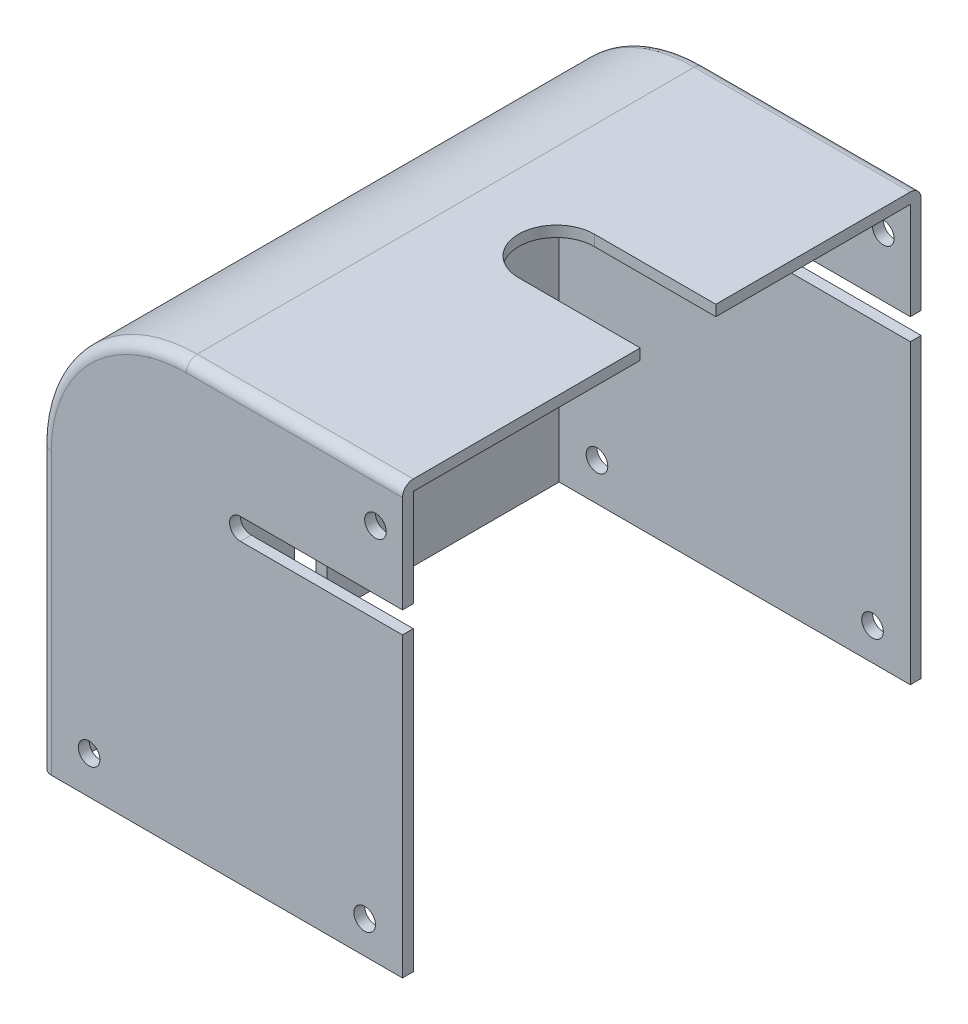
ISO-10303-21;
HEADER;
FILE_DESCRIPTION(('STEP AP214'),'2;1');
FILE_NAME('part.step','',(''),(''),'','','');
FILE_SCHEMA(('AUTOMOTIVE_DESIGN { 1 0 10303 214 1 1 1 1 }'));
ENDSEC;
DATA;
#1=APPLICATION_CONTEXT('core data for automotive mechanical design processes');
#2=APPLICATION_PROTOCOL_DEFINITION('international standard','automotive_design',2000,#1);
#3=PRODUCT_CONTEXT('',#1,'mechanical');
#4=PRODUCT('Part','Part','',(#3));
#5=PRODUCT_RELATED_PRODUCT_CATEGORY('part','',(#4));
#6=PRODUCT_DEFINITION_FORMATION('','',#4);
#7=PRODUCT_DEFINITION_CONTEXT('part definition',#1,'design');
#8=PRODUCT_DEFINITION('design','',#6,#7);
#9=PRODUCT_DEFINITION_SHAPE('','',#8);
#10=(LENGTH_UNIT() NAMED_UNIT(*) SI_UNIT(.MILLI.,.METRE.));
#11=(NAMED_UNIT(*) PLANE_ANGLE_UNIT() SI_UNIT($,.RADIAN.));
#12=(NAMED_UNIT(*) SI_UNIT($,.STERADIAN.) SOLID_ANGLE_UNIT());
#13=UNCERTAINTY_MEASURE_WITH_UNIT(LENGTH_MEASURE(1.E-05),#10,'distance_accuracy_value','');
#14=(GEOMETRIC_REPRESENTATION_CONTEXT(3) GLOBAL_UNCERTAINTY_ASSIGNED_CONTEXT((#13)) GLOBAL_UNIT_ASSIGNED_CONTEXT((#10,
#11,#12)) REPRESENTATION_CONTEXT('',''));
#15=CARTESIAN_POINT('',(0.,0.,0.));
#16=DIRECTION('',(0.,0.,1.));
#17=DIRECTION('',(1.,0.,0.));
#18=AXIS2_PLACEMENT_3D('',#15,#16,#17);
#19=CARTESIAN_POINT('',(0.,0.,46.));
#20=DIRECTION('',(-1.,0.,0.));
#21=DIRECTION('',(0.,0.,1.));
#22=AXIS2_PLACEMENT_3D('',#19,#20,#21);
#23=PLANE('',#22);
#24=DIRECTION('',(0.,0.,-1.));
#25=VECTOR('',#24,1.);
#26=CARTESIAN_POINT('',(0.,0.,46.));
#27=LINE('',#26,#25);
#28=CARTESIAN_POINT('',(0.,0.,46.));
#29=VERTEX_POINT('',#28);
#30=CARTESIAN_POINT('',(0.,0.,4.));
#31=VERTEX_POINT('',#30);
#32=EDGE_CURVE('E473',#29,#31,#27,.T.);
#33=ORIENTED_EDGE('',*,*,#32,.T.);
#34=DIRECTION('',(0.,1.,0.));
#35=VECTOR('',#34,1.);
#36=CARTESIAN_POINT('',(0.,-77.,4.));
#37=LINE('',#36,#35);
#38=CARTESIAN_POINT('',(0.,2.,4.));
#39=VERTEX_POINT('',#38);
#40=EDGE_CURVE('E364',#31,#39,#37,.T.);
#41=ORIENTED_EDGE('',*,*,#40,.T.);
#42=DIRECTION('',(0.,0.,-1.));
#43=VECTOR('',#42,1.);
#44=CARTESIAN_POINT('',(0.,2.,46.));
#45=LINE('',#44,#43);
#46=CARTESIAN_POINT('',(0.,2.,46.));
#47=VERTEX_POINT('',#46);
#48=EDGE_CURVE('E263',#47,#39,#45,.T.);
#49=ORIENTED_EDGE('',*,*,#48,.F.);
#50=CARTESIAN_POINT('',(0.,0.,46.));
#51=DIRECTION('',(-1.,0.,0.));
#52=DIRECTION('',(0.,0.,1.));
#53=AXIS2_PLACEMENT_3D('',#50,#51,#52);
#54=CIRCLE('',#53,2.);
#55=CARTESIAN_POINT('',(0.,0.,48.));
#56=VERTEX_POINT('',#55);
#57=EDGE_CURVE('E295',#47,#56,#54,.F.);
#58=ORIENTED_EDGE('',*,*,#57,.T.);
#59=DIRECTION('',(0.,1.,0.));
#60=VECTOR('',#59,1.);
#61=CARTESIAN_POINT('',(0.,-77.,48.));
#62=LINE('',#61,#60);
#63=CARTESIAN_POINT('',(0.,-18.,48.));
#64=VERTEX_POINT('',#63);
#65=EDGE_CURVE('E442',#64,#56,#62,.T.);
#66=ORIENTED_EDGE('',*,*,#65,.F.);
#67=DIRECTION('',(0.,0.,1.));
#68=VECTOR('',#67,1.);
#69=CARTESIAN_POINT('',(0.,-18.,-48.));
#70=LINE('',#69,#68);
#71=CARTESIAN_POINT('',(0.,-18.,46.));
#72=VERTEX_POINT('',#71);
#73=EDGE_CURVE('E64',#72,#64,#70,.T.);
#74=ORIENTED_EDGE('',*,*,#73,.F.);
#75=DIRECTION('',(0.,1.,0.));
#76=VECTOR('',#75,1.);
#77=CARTESIAN_POINT('',(0.,-77.,46.));
#78=LINE('',#77,#76);
#79=EDGE_CURVE('E449',#72,#29,#78,.T.);
#80=ORIENTED_EDGE('',*,*,#79,.T.);
#81=EDGE_LOOP('',(#33,#41,#49,#58,#66,#74,#80));
#82=FACE_BOUND('',#81,.T.);
#83=ADVANCED_FACE('F39',(#82),#23,.F.);
#84=CARTESIAN_POINT('',(0.,-77.,46.));
#85=VERTEX_POINT('',#84);
#86=CARTESIAN_POINT('',(0.,-22.,46.));
#87=VERTEX_POINT('',#86);
#88=EDGE_CURVE('E443',#85,#87,#78,.T.);
#89=ORIENTED_EDGE('',*,*,#88,.T.);
#90=DIRECTION('',(0.,0.,1.));
#91=VECTOR('',#90,1.);
#92=CARTESIAN_POINT('',(0.,-22.,-48.));
#93=LINE('',#92,#91);
#94=CARTESIAN_POINT('',(0.,-22.,48.));
#95=VERTEX_POINT('',#94);
#96=EDGE_CURVE('E390',#87,#95,#93,.T.);
#97=ORIENTED_EDGE('',*,*,#96,.T.);
#98=CARTESIAN_POINT('',(0.,-77.,48.));
#99=VERTEX_POINT('',#98);
#100=EDGE_CURVE('E444',#99,#95,#62,.T.);
#101=ORIENTED_EDGE('',*,*,#100,.F.);
#102=DIRECTION('',(0.,0.,-1.));
#103=VECTOR('',#102,1.);
#104=CARTESIAN_POINT('',(0.,-77.,48.));
#105=LINE('',#104,#103);
#106=EDGE_CURVE('E447',#99,#85,#105,.T.);
#107=ORIENTED_EDGE('',*,*,#106,.T.);
#108=EDGE_LOOP('',(#89,#97,#101,#107));
#109=FACE_BOUND('',#108,.T.);
#110=ADVANCED_FACE('F564',(#109),#23,.F.);
#111=DIRECTION('',(0.,1.,0.));
#112=VECTOR('',#111,1.);
#113=CARTESIAN_POINT('',(0.,-77.,-48.));
#114=LINE('',#113,#112);
#115=CARTESIAN_POINT('',(0.,-77.,-48.));
#116=VERTEX_POINT('',#115);
#117=CARTESIAN_POINT('',(0.,-22.,-48.));
#118=VERTEX_POINT('',#117);
#119=EDGE_CURVE('E425',#116,#118,#114,.T.);
#120=ORIENTED_EDGE('',*,*,#119,.T.);
#121=CARTESIAN_POINT('',(0.,-22.,-46.));
#122=VERTEX_POINT('',#121);
#123=EDGE_CURVE('E386',#118,#122,#93,.T.);
#124=ORIENTED_EDGE('',*,*,#123,.T.);
#125=DIRECTION('',(0.,1.,0.));
#126=VECTOR('',#125,1.);
#127=CARTESIAN_POINT('',(0.,-77.,-46.));
#128=LINE('',#127,#126);
#129=CARTESIAN_POINT('',(0.,-77.,-46.));
#130=VERTEX_POINT('',#129);
#131=EDGE_CURVE('E432',#130,#122,#128,.T.);
#132=ORIENTED_EDGE('',*,*,#131,.F.);
#133=DIRECTION('',(0.,0.,1.));
#134=VECTOR('',#133,1.);
#135=CARTESIAN_POINT('',(0.,-77.,-48.));
#136=LINE('',#135,#134);
#137=EDGE_CURVE('E431',#116,#130,#136,.T.);
#138=ORIENTED_EDGE('',*,*,#137,.F.);
#139=EDGE_LOOP('',(#120,#124,#132,#138));
#140=FACE_BOUND('',#139,.T.);
#141=ADVANCED_FACE('F518',(#140),#23,.F.);
#142=CARTESIAN_POINT('',(-65.,-77.,46.));
#143=DIRECTION('',(0.,1.,0.));
#144=DIRECTION('',(0.,0.,1.));
#145=AXIS2_PLACEMENT_3D('',#142,#143,#144);
#146=PLANE('',#145);
#147=DIRECTION('',(0.,0.,-1.));
#148=VECTOR('',#147,1.);
#149=CARTESIAN_POINT('',(-65.,-77.,46.));
#150=LINE('',#149,#148);
#151=CARTESIAN_POINT('',(-65.,-77.,-3.));
#152=VERTEX_POINT('',#151);
#153=CARTESIAN_POINT('',(-65.,-77.,-46.));
#154=VERTEX_POINT('',#153);
#155=EDGE_CURVE('E482',#152,#154,#150,.T.);
#156=ORIENTED_EDGE('',*,*,#155,.F.);
#157=DIRECTION('',(-1.,0.,0.));
#158=VECTOR('',#157,1.);
#159=CARTESIAN_POINT('',(-62.,-77.,-3.));
#160=LINE('',#159,#158);
#161=CARTESIAN_POINT('',(-67.,-77.,-3.));
#162=VERTEX_POINT('',#161);
#163=EDGE_CURVE('E318',#152,#162,#160,.T.);
#164=ORIENTED_EDGE('',*,*,#163,.T.);
#165=DIRECTION('',(0.,0.,-1.));
#166=VECTOR('',#165,1.);
#167=CARTESIAN_POINT('',(-67.,-77.,46.));
#168=LINE('',#167,#166);
#169=CARTESIAN_POINT('',(-67.,-77.,-46.));
#170=VERTEX_POINT('',#169);
#171=EDGE_CURVE('E486',#162,#170,#168,.T.);
#172=ORIENTED_EDGE('',*,*,#171,.T.);
#173=CARTESIAN_POINT('',(-65.,-77.,-46.));
#174=DIRECTION('',(0.,1.,0.));
#175=DIRECTION('',(0.,0.,1.));
#176=AXIS2_PLACEMENT_3D('',#173,#174,#175);
#177=CIRCLE('',#176,2.);
#178=CARTESIAN_POINT('',(-65.,-77.,-48.));
#179=VERTEX_POINT('',#178);
#180=EDGE_CURVE('E278',#170,#179,#177,.F.);
#181=ORIENTED_EDGE('',*,*,#180,.T.);
#182=DIRECTION('',(1.,0.,0.));
#183=VECTOR('',#182,1.);
#184=CARTESIAN_POINT('',(-67.,-77.,-48.));
#185=LINE('',#184,#183);
#186=EDGE_CURVE('E428',#179,#116,#185,.T.);
#187=ORIENTED_EDGE('',*,*,#186,.T.);
#188=ORIENTED_EDGE('',*,*,#137,.T.);
#189=DIRECTION('',(1.,0.,0.));
#190=VECTOR('',#189,1.);
#191=CARTESIAN_POINT('',(-67.,-77.,-46.));
#192=LINE('',#191,#190);
#193=EDGE_CURVE('E435',#154,#130,#192,.T.);
#194=ORIENTED_EDGE('',*,*,#193,.F.);
#195=EDGE_LOOP('',(#156,#164,#172,#181,#187,#188,#194));
#196=FACE_BOUND('',#195,.T.);
#197=ADVANCED_FACE('F511',(#196),#146,.F.);
#198=CARTESIAN_POINT('',(0.,2.,-10.));
#199=VERTEX_POINT('',#198);
#200=CARTESIAN_POINT('',(0.,2.,-46.));
#201=VERTEX_POINT('',#200);
#202=EDGE_CURVE('E252',#199,#201,#45,.T.);
#203=ORIENTED_EDGE('',*,*,#202,.F.);
#204=DIRECTION('',(0.,1.,0.));
#205=VECTOR('',#204,1.);
#206=CARTESIAN_POINT('',(0.,-77.,-10.));
#207=LINE('',#206,#205);
#208=CARTESIAN_POINT('',(0.,0.,-10.));
#209=VERTEX_POINT('',#208);
#210=EDGE_CURVE('E237',#209,#199,#207,.T.);
#211=ORIENTED_EDGE('',*,*,#210,.F.);
#212=CARTESIAN_POINT('',(0.,0.,-46.));
#213=VERTEX_POINT('',#212);
#214=EDGE_CURVE('E465',#209,#213,#27,.T.);
#215=ORIENTED_EDGE('',*,*,#214,.T.);
#216=CARTESIAN_POINT('',(0.,-18.,-46.));
#217=VERTEX_POINT('',#216);
#218=EDGE_CURVE('E314',#217,#213,#128,.T.);
#219=ORIENTED_EDGE('',*,*,#218,.F.);
#220=CARTESIAN_POINT('',(0.,-18.,-48.));
#221=VERTEX_POINT('',#220);
#222=EDGE_CURVE('E399',#221,#217,#70,.T.);
#223=ORIENTED_EDGE('',*,*,#222,.F.);
#224=CARTESIAN_POINT('',(0.,0.,-48.));
#225=VERTEX_POINT('',#224);
#226=EDGE_CURVE('E429',#221,#225,#114,.T.);
#227=ORIENTED_EDGE('',*,*,#226,.T.);
#228=CARTESIAN_POINT('',(0.,0.,-46.));
#229=DIRECTION('',(-1.,0.,0.));
#230=DIRECTION('',(0.,0.,1.));
#231=AXIS2_PLACEMENT_3D('',#228,#229,#230);
#232=CIRCLE('',#231,2.);
#233=EDGE_CURVE('E261',#225,#201,#232,.F.);
#234=ORIENTED_EDGE('',*,*,#233,.T.);
#235=EDGE_LOOP('',(#203,#211,#215,#219,#223,#227,#234));
#236=FACE_BOUND('',#235,.T.);
#237=ADVANCED_FACE('F259',(#236),#23,.F.);
#238=CARTESIAN_POINT('',(0.,2.,46.));
#239=DIRECTION('',(0.,-1.,0.));
#240=DIRECTION('',(0.,0.,-1.));
#241=AXIS2_PLACEMENT_3D('',#238,#239,#240);
#242=PLANE('',#241);
#243=ORIENTED_EDGE('',*,*,#48,.T.);
#244=DIRECTION('',(1.,0.,0.));
#245=VECTOR('',#244,1.);
#246=CARTESIAN_POINT('',(0.,2.,4.));
#247=LINE('',#246,#245);
#248=CARTESIAN_POINT('',(-22.5,2.,4.));
#249=VERTEX_POINT('',#248);
#250=EDGE_CURVE('E247',#249,#39,#247,.T.);
#251=ORIENTED_EDGE('',*,*,#250,.F.);
#252=CARTESIAN_POINT('',(-22.5,2.,-3.));
#253=DIRECTION('',(0.,1.,0.));
#254=DIRECTION('',(0.,0.,1.));
#255=AXIS2_PLACEMENT_3D('',#252,#253,#254);
#256=CIRCLE('',#255,7.);
#257=CARTESIAN_POINT('',(-22.5,2.,-10.));
#258=VERTEX_POINT('',#257);
#259=EDGE_CURVE('E256',#258,#249,#256,.T.);
#260=ORIENTED_EDGE('',*,*,#259,.F.);
#261=DIRECTION('',(-1.,0.,0.));
#262=VECTOR('',#261,1.);
#263=CARTESIAN_POINT('',(0.,2.,-10.));
#264=LINE('',#263,#262);
#265=EDGE_CURVE('E240',#199,#258,#264,.T.);
#266=ORIENTED_EDGE('',*,*,#265,.F.);
#267=ORIENTED_EDGE('',*,*,#202,.T.);
#268=DIRECTION('',(-1.,0.,0.));
#269=VECTOR('',#268,1.);
#270=CARTESIAN_POINT('',(-40.,2.,-46.));
#271=LINE('',#270,#269);
#272=CARTESIAN_POINT('',(-40.,2.,-46.));
#273=VERTEX_POINT('',#272);
#274=EDGE_CURVE('E293',#201,#273,#271,.T.);
#275=ORIENTED_EDGE('',*,*,#274,.T.);
#276=DIRECTION('',(0.,0.,-1.));
#277=VECTOR('',#276,1.);
#278=CARTESIAN_POINT('',(-40.,2.,46.));
#279=LINE('',#278,#277);
#280=CARTESIAN_POINT('',(-40.,2.,46.));
#281=VERTEX_POINT('',#280);
#282=EDGE_CURVE('E264',#281,#273,#279,.T.);
#283=ORIENTED_EDGE('',*,*,#282,.F.);
#284=DIRECTION('',(-1.,0.,0.));
#285=VECTOR('',#284,1.);
#286=CARTESIAN_POINT('',(0.,2.,46.));
#287=LINE('',#286,#285);
#288=EDGE_CURVE('E291',#281,#47,#287,.F.);
#289=ORIENTED_EDGE('',*,*,#288,.T.);
#290=EDGE_LOOP('',(#243,#251,#260,#266,#267,#275,#283,#289));
#291=FACE_BOUND('',#290,.T.);
#292=ADVANCED_FACE('F251',(#291),#242,.F.);
#293=CARTESIAN_POINT('',(-40.,-25.,46.));
#294=DIRECTION('',(0.,0.,-1.));
#295=DIRECTION('',(-1.,0.,0.));
#296=AXIS2_PLACEMENT_3D('',#293,#294,#295);
#297=CYLINDRICAL_SURFACE('',#296,27.);
#298=ORIENTED_EDGE('',*,*,#282,.T.);
#299=CARTESIAN_POINT('',(-40.,-25.,-46.));
#300=DIRECTION('',(0.,0.,-1.));
#301=DIRECTION('',(-1.,0.,0.));
#302=AXIS2_PLACEMENT_3D('',#299,#300,#301);
#303=CIRCLE('',#302,27.);
#304=CARTESIAN_POINT('',(-67.,-25.,-46.));
#305=VERTEX_POINT('',#304);
#306=EDGE_CURVE('E289',#273,#305,#303,.F.);
#307=ORIENTED_EDGE('',*,*,#306,.T.);
#308=DIRECTION('',(0.,0.,-1.));
#309=VECTOR('',#308,1.);
#310=CARTESIAN_POINT('',(-67.,-25.,46.));
#311=LINE('',#310,#309);
#312=CARTESIAN_POINT('',(-67.,-25.,46.));
#313=VERTEX_POINT('',#312);
#314=EDGE_CURVE('E268',#313,#305,#311,.T.);
#315=ORIENTED_EDGE('',*,*,#314,.F.);
#316=CARTESIAN_POINT('',(-40.,-25.,46.));
#317=DIRECTION('',(0.,0.,1.));
#318=DIRECTION('',(1.,0.,0.));
#319=AXIS2_PLACEMENT_3D('',#316,#317,#318);
#320=CIRCLE('',#319,27.);
#321=EDGE_CURVE('E287',#313,#281,#320,.F.);
#322=ORIENTED_EDGE('',*,*,#321,.T.);
#323=EDGE_LOOP('',(#298,#307,#315,#322));
#324=FACE_BOUND('',#323,.T.);
#325=ADVANCED_FACE('F578',(#324),#297,.T.);
#326=CARTESIAN_POINT('',(-67.,-25.,46.));
#327=DIRECTION('',(1.,0.,0.));
#328=DIRECTION('',(0.,0.,-1.));
#329=AXIS2_PLACEMENT_3D('',#326,#327,#328);
#330=PLANE('',#329);
#331=ORIENTED_EDGE('',*,*,#171,.F.);
#332=DIRECTION('',(0.,-1.,0.));
#333=VECTOR('',#332,1.);
#334=CARTESIAN_POINT('',(-67.,-77.,-3.));
#335=LINE('',#334,#333);
#336=CARTESIAN_POINT('',(-67.,-47.,-3.));
#337=VERTEX_POINT('',#336);
#338=EDGE_CURVE('E415',#337,#162,#335,.T.);
#339=ORIENTED_EDGE('',*,*,#338,.F.);
#340=CARTESIAN_POINT('',(-67.,-47.,0.));
#341=DIRECTION('',(-1.,0.,0.));
#342=DIRECTION('',(0.,0.,1.));
#343=AXIS2_PLACEMENT_3D('',#340,#341,#342);
#344=CIRCLE('',#343,3.);
#345=CARTESIAN_POINT('',(-67.,-47.,3.));
#346=VERTEX_POINT('',#345);
#347=EDGE_CURVE('E412',#346,#337,#344,.T.);
#348=ORIENTED_EDGE('',*,*,#347,.F.);
#349=DIRECTION('',(0.,1.,0.));
#350=VECTOR('',#349,1.);
#351=CARTESIAN_POINT('',(-67.,-77.,3.));
#352=LINE('',#351,#350);
#353=CARTESIAN_POINT('',(-67.,-77.,3.));
#354=VERTEX_POINT('',#353);
#355=EDGE_CURVE('E409',#354,#346,#352,.T.);
#356=ORIENTED_EDGE('',*,*,#355,.F.);
#357=CARTESIAN_POINT('',(-67.,-77.,46.));
#358=VERTEX_POINT('',#357);
#359=EDGE_CURVE('E487',#358,#354,#168,.T.);
#360=ORIENTED_EDGE('',*,*,#359,.F.);
#361=DIRECTION('',(0.,-1.,0.));
#362=VECTOR('',#361,1.);
#363=CARTESIAN_POINT('',(-67.,-25.,46.));
#364=LINE('',#363,#362);
#365=EDGE_CURVE('E266',#358,#313,#364,.F.);
#366=ORIENTED_EDGE('',*,*,#365,.T.);
#367=ORIENTED_EDGE('',*,*,#314,.T.);
#368=DIRECTION('',(0.,-1.,0.));
#369=VECTOR('',#368,1.);
#370=CARTESIAN_POINT('',(-67.,-77.,-46.));
#371=LINE('',#370,#369);
#372=EDGE_CURVE('E273',#305,#170,#371,.T.);
#373=ORIENTED_EDGE('',*,*,#372,.T.);
#374=EDGE_LOOP('',(#331,#339,#348,#356,#360,#366,#367,#373));
#375=FACE_BOUND('',#374,.T.);
#376=ADVANCED_FACE('F494',(#375),#330,.F.);
#377=ORIENTED_EDGE('',*,*,#359,.T.);
#378=DIRECTION('',(-1.,0.,0.));
#379=VECTOR('',#378,1.);
#380=CARTESIAN_POINT('',(-62.,-77.,3.));
#381=LINE('',#380,#379);
#382=CARTESIAN_POINT('',(-65.,-77.,3.));
#383=VERTEX_POINT('',#382);
#384=EDGE_CURVE('E417',#383,#354,#381,.T.);
#385=ORIENTED_EDGE('',*,*,#384,.F.);
#386=CARTESIAN_POINT('',(-65.,-77.,46.));
#387=VERTEX_POINT('',#386);
#388=EDGE_CURVE('E483',#387,#383,#150,.T.);
#389=ORIENTED_EDGE('',*,*,#388,.F.);
#390=DIRECTION('',(1.,0.,0.));
#391=VECTOR('',#390,1.);
#392=CARTESIAN_POINT('',(-67.,-77.,46.));
#393=LINE('',#392,#391);
#394=EDGE_CURVE('E439',#387,#85,#393,.T.);
#395=ORIENTED_EDGE('',*,*,#394,.T.);
#396=ORIENTED_EDGE('',*,*,#106,.F.);
#397=DIRECTION('',(1.,0.,0.));
#398=VECTOR('',#397,1.);
#399=CARTESIAN_POINT('',(-67.,-77.,48.));
#400=LINE('',#399,#398);
#401=CARTESIAN_POINT('',(-65.,-77.,48.));
#402=VERTEX_POINT('',#401);
#403=EDGE_CURVE('E440',#402,#99,#400,.T.);
#404=ORIENTED_EDGE('',*,*,#403,.F.);
#405=CARTESIAN_POINT('',(-65.,-77.,46.));
#406=DIRECTION('',(0.,1.,0.));
#407=DIRECTION('',(0.,0.,1.));
#408=AXIS2_PLACEMENT_3D('',#405,#406,#407);
#409=CIRCLE('',#408,2.);
#410=EDGE_CURVE('E276',#402,#358,#409,.F.);
#411=ORIENTED_EDGE('',*,*,#410,.T.);
#412=EDGE_LOOP('',(#377,#385,#389,#395,#396,#404,#411));
#413=FACE_BOUND('',#412,.T.);
#414=ADVANCED_FACE('F537',(#413),#146,.F.);
#415=CARTESIAN_POINT('',(-65.,-25.,46.));
#416=DIRECTION('',(-1.,0.,0.));
#417=DIRECTION('',(0.,-1.,0.));
#418=AXIS2_PLACEMENT_3D('',#415,#416,#417);
#419=PLANE('',#418);
#420=CARTESIAN_POINT('',(-65.,-47.,0.));
#421=DIRECTION('',(-1.,0.,0.));
#422=DIRECTION('',(0.,-1.,0.));
#423=AXIS2_PLACEMENT_3D('',#420,#421,#422);
#424=CIRCLE('',#423,3.);
#425=CARTESIAN_POINT('',(-65.,-47.,3.));
#426=VERTEX_POINT('',#425);
#427=CARTESIAN_POINT('',(-65.,-47.,-3.));
#428=VERTEX_POINT('',#427);
#429=EDGE_CURVE('E323',#426,#428,#424,.T.);
#430=ORIENTED_EDGE('',*,*,#429,.T.);
#431=DIRECTION('',(0.,-1.,0.));
#432=VECTOR('',#431,1.);
#433=CARTESIAN_POINT('',(-65.,-25.,-3.));
#434=LINE('',#433,#432);
#435=EDGE_CURVE('E326',#428,#152,#434,.T.);
#436=ORIENTED_EDGE('',*,*,#435,.T.);
#437=ORIENTED_EDGE('',*,*,#155,.T.);
#438=DIRECTION('',(0.,1.,0.));
#439=VECTOR('',#438,1.);
#440=CARTESIAN_POINT('',(-65.,-25.,-46.));
#441=LINE('',#440,#439);
#442=CARTESIAN_POINT('',(-65.,-25.,-46.));
#443=VERTEX_POINT('',#442);
#444=EDGE_CURVE('E454',#154,#443,#441,.T.);
#445=ORIENTED_EDGE('',*,*,#444,.T.);
#446=DIRECTION('',(0.,0.,-1.));
#447=VECTOR('',#446,1.);
#448=CARTESIAN_POINT('',(-65.,-25.,46.));
#449=LINE('',#448,#447);
#450=CARTESIAN_POINT('',(-65.,-25.,46.));
#451=VERTEX_POINT('',#450);
#452=EDGE_CURVE('E479',#451,#443,#449,.T.);
#453=ORIENTED_EDGE('',*,*,#452,.F.);
#454=DIRECTION('',(0.,1.,0.));
#455=VECTOR('',#454,1.);
#456=CARTESIAN_POINT('',(-65.,-25.,46.));
#457=LINE('',#456,#455);
#458=EDGE_CURVE('E455',#387,#451,#457,.T.);
#459=ORIENTED_EDGE('',*,*,#458,.F.);
#460=ORIENTED_EDGE('',*,*,#388,.T.);
#461=DIRECTION('',(0.,1.,0.));
#462=VECTOR('',#461,1.);
#463=CARTESIAN_POINT('',(-65.,-25.,3.));
#464=LINE('',#463,#462);
#465=EDGE_CURVE('E306',#383,#426,#464,.T.);
#466=ORIENTED_EDGE('',*,*,#465,.T.);
#467=EDGE_LOOP('',(#430,#436,#437,#445,#453,#459,#460,#466));
#468=FACE_BOUND('',#467,.T.);
#469=ADVANCED_FACE('F525',(#468),#419,.F.);
#470=CARTESIAN_POINT('',(-40.,-25.,46.));
#471=DIRECTION('',(0.,0.,-1.));
#472=DIRECTION('',(-1.,0.,0.));
#473=AXIS2_PLACEMENT_3D('',#470,#471,#472);
#474=CYLINDRICAL_SURFACE('',#473,25.);
#475=CARTESIAN_POINT('',(-40.,-25.,-46.));
#476=DIRECTION('',(0.,0.,-1.));
#477=DIRECTION('',(1.,0.,0.));
#478=AXIS2_PLACEMENT_3D('',#475,#476,#477);
#479=CIRCLE('',#478,25.);
#480=CARTESIAN_POINT('',(-40.,0.,-46.));
#481=VERTEX_POINT('',#480);
#482=EDGE_CURVE('E468',#443,#481,#479,.T.);
#483=ORIENTED_EDGE('',*,*,#482,.T.);
#484=DIRECTION('',(0.,0.,-1.));
#485=VECTOR('',#484,1.);
#486=CARTESIAN_POINT('',(-40.,0.,46.));
#487=LINE('',#486,#485);
#488=CARTESIAN_POINT('',(-40.,0.,46.));
#489=VERTEX_POINT('',#488);
#490=EDGE_CURVE('E476',#489,#481,#487,.T.);
#491=ORIENTED_EDGE('',*,*,#490,.F.);
#492=CARTESIAN_POINT('',(-40.,-25.,46.));
#493=DIRECTION('',(0.,0.,-1.));
#494=DIRECTION('',(1.,0.,0.));
#495=AXIS2_PLACEMENT_3D('',#492,#493,#494);
#496=CIRCLE('',#495,25.);
#497=EDGE_CURVE('E458',#451,#489,#496,.T.);
#498=ORIENTED_EDGE('',*,*,#497,.F.);
#499=ORIENTED_EDGE('',*,*,#452,.T.);
#500=EDGE_LOOP('',(#483,#491,#498,#499));
#501=FACE_BOUND('',#500,.T.);
#502=ADVANCED_FACE('F529',(#501),#474,.F.);
#503=CARTESIAN_POINT('',(0.,0.,46.));
#504=DIRECTION('',(0.,1.,0.));
#505=DIRECTION('',(-1.,0.,0.));
#506=AXIS2_PLACEMENT_3D('',#503,#504,#505);
#507=PLANE('',#506);
#508=CARTESIAN_POINT('',(-22.5,0.,-3.));
#509=DIRECTION('',(0.,1.,0.));
#510=DIRECTION('',(-1.,0.,0.));
#511=AXIS2_PLACEMENT_3D('',#508,#509,#510);
#512=CIRCLE('',#511,7.);
#513=CARTESIAN_POINT('',(-22.5,0.,-10.));
#514=VERTEX_POINT('',#513);
#515=CARTESIAN_POINT('',(-22.5,0.,4.));
#516=VERTEX_POINT('',#515);
#517=EDGE_CURVE('E48',#514,#516,#512,.T.);
#518=ORIENTED_EDGE('',*,*,#517,.T.);
#519=DIRECTION('',(1.,0.,0.));
#520=VECTOR('',#519,1.);
#521=CARTESIAN_POINT('',(0.,0.,4.));
#522=LINE('',#521,#520);
#523=EDGE_CURVE('E11',#516,#31,#522,.T.);
#524=ORIENTED_EDGE('',*,*,#523,.T.);
#525=ORIENTED_EDGE('',*,*,#32,.F.);
#526=DIRECTION('',(1.,0.,0.));
#527=VECTOR('',#526,1.);
#528=CARTESIAN_POINT('',(0.,0.,46.));
#529=LINE('',#528,#527);
#530=EDGE_CURVE('E462',#489,#29,#529,.T.);
#531=ORIENTED_EDGE('',*,*,#530,.F.);
#532=ORIENTED_EDGE('',*,*,#490,.T.);
#533=DIRECTION('',(1.,0.,0.));
#534=VECTOR('',#533,1.);
#535=CARTESIAN_POINT('',(0.,0.,-46.));
#536=LINE('',#535,#534);
#537=EDGE_CURVE('E459',#481,#213,#536,.T.);
#538=ORIENTED_EDGE('',*,*,#537,.T.);
#539=ORIENTED_EDGE('',*,*,#214,.F.);
#540=DIRECTION('',(-1.,0.,0.));
#541=VECTOR('',#540,1.);
#542=CARTESIAN_POINT('',(0.,0.,-10.));
#543=LINE('',#542,#541);
#544=EDGE_CURVE('E243',#209,#514,#543,.T.);
#545=ORIENTED_EDGE('',*,*,#544,.T.);
#546=EDGE_LOOP('',(#518,#524,#525,#531,#532,#538,#539,#545));
#547=FACE_BOUND('',#546,.T.);
#548=ADVANCED_FACE('F746',(#547),#507,.F.);
#549=CARTESIAN_POINT('',(-40.,-25.,46.));
#550=DIRECTION('',(0.,0.,1.));
#551=DIRECTION('',(1.,0.,0.));
#552=AXIS2_PLACEMENT_3D('',#549,#550,#551);
#553=PLANE('',#552);
#554=CARTESIAN_POINT('',(-5.,-7.,46.));
#555=DIRECTION('',(0.,0.,1.));
#556=DIRECTION('',(1.,0.,0.));
#557=AXIS2_PLACEMENT_3D('',#554,#555,#556);
#558=CIRCLE('',#557,2.);
#559=CARTESIAN_POINT('',(-3.,-7.,46.));
#560=VERTEX_POINT('',#559);
#561=EDGE_CURVE('E257',#560,#560,#558,.T.);
#562=ORIENTED_EDGE('',*,*,#561,.T.);
#563=EDGE_LOOP('',(#562));
#564=FACE_BOUND('',#563,.T.);
#565=CARTESIAN_POINT('',(-7.,-71.,46.));
#566=DIRECTION('',(0.,0.,1.));
#567=DIRECTION('',(1.,0.,0.));
#568=AXIS2_PLACEMENT_3D('',#565,#566,#567);
#569=CIRCLE('',#568,2.);
#570=CARTESIAN_POINT('',(-5.,-71.,46.));
#571=VERTEX_POINT('',#570);
#572=EDGE_CURVE('E347',#571,#571,#569,.T.);
#573=ORIENTED_EDGE('',*,*,#572,.T.);
#574=EDGE_LOOP('',(#573));
#575=FACE_BOUND('',#574,.T.);
#576=CARTESIAN_POINT('',(-58.,-70.,46.));
#577=DIRECTION('',(0.,0.,1.));
#578=DIRECTION('',(1.,0.,0.));
#579=AXIS2_PLACEMENT_3D('',#576,#577,#578);
#580=CIRCLE('',#579,2.);
#581=CARTESIAN_POINT('',(-56.,-70.,46.));
#582=VERTEX_POINT('',#581);
#583=EDGE_CURVE('E343',#582,#582,#580,.T.);
#584=ORIENTED_EDGE('',*,*,#583,.T.);
#585=EDGE_LOOP('',(#584));
#586=FACE_BOUND('',#585,.T.);
#587=CARTESIAN_POINT('',(-30.,-20.,46.));
#588=DIRECTION('',(0.,0.,1.));
#589=DIRECTION('',(1.,0.,0.));
#590=AXIS2_PLACEMENT_3D('',#587,#588,#589);
#591=CIRCLE('',#590,2.);
#592=CARTESIAN_POINT('',(-30.,-18.,46.));
#593=VERTEX_POINT('',#592);
#594=CARTESIAN_POINT('',(-30.,-22.,46.));
#595=VERTEX_POINT('',#594);
#596=EDGE_CURVE('E403',#593,#595,#591,.T.);
#597=ORIENTED_EDGE('',*,*,#596,.T.);
#598=DIRECTION('',(1.,0.,0.));
#599=VECTOR('',#598,1.);
#600=CARTESIAN_POINT('',(-40.,-22.,46.));
#601=LINE('',#600,#599);
#602=EDGE_CURVE('E406',#595,#87,#601,.T.);
#603=ORIENTED_EDGE('',*,*,#602,.T.);
#604=ORIENTED_EDGE('',*,*,#88,.F.);
#605=ORIENTED_EDGE('',*,*,#394,.F.);
#606=ORIENTED_EDGE('',*,*,#458,.T.);
#607=ORIENTED_EDGE('',*,*,#497,.T.);
#608=ORIENTED_EDGE('',*,*,#530,.T.);
#609=ORIENTED_EDGE('',*,*,#79,.F.);
#610=DIRECTION('',(-1.,0.,0.));
#611=VECTOR('',#610,1.);
#612=CARTESIAN_POINT('',(-40.,-18.,46.));
#613=LINE('',#612,#611);
#614=EDGE_CURVE('E389',#72,#593,#613,.T.);
#615=ORIENTED_EDGE('',*,*,#614,.T.);
#616=EDGE_LOOP('',(#597,#603,#604,#605,#606,#607,#608,#609,#615));
#617=FACE_BOUND('',#616,.T.);
#618=ADVANCED_FACE('F533',(#564,#575,#586,#617),#553,.F.);
#619=CARTESIAN_POINT('',(-40.,-25.,48.));
#620=DIRECTION('',(0.,0.,1.));
#621=DIRECTION('',(1.,0.,0.));
#622=AXIS2_PLACEMENT_3D('',#619,#620,#621);
#623=PLANE('',#622);
#624=CARTESIAN_POINT('',(-5.,-7.,48.));
#625=DIRECTION('',(0.,0.,1.));
#626=DIRECTION('',(1.,0.,0.));
#627=AXIS2_PLACEMENT_3D('',#624,#625,#626);
#628=CIRCLE('',#627,2.);
#629=CARTESIAN_POINT('',(-3.,-7.,48.));
#630=VERTEX_POINT('',#629);
#631=EDGE_CURVE('E741',#630,#630,#628,.T.);
#632=ORIENTED_EDGE('',*,*,#631,.F.);
#633=EDGE_LOOP('',(#632));
#634=FACE_BOUND('',#633,.T.);
#635=CARTESIAN_POINT('',(-7.,-71.,48.));
#636=DIRECTION('',(0.,0.,1.));
#637=DIRECTION('',(1.,0.,0.));
#638=AXIS2_PLACEMENT_3D('',#635,#636,#637);
#639=CIRCLE('',#638,2.);
#640=CARTESIAN_POINT('',(-5.,-71.,48.));
#641=VERTEX_POINT('',#640);
#642=EDGE_CURVE('E1011',#641,#641,#639,.T.);
#643=ORIENTED_EDGE('',*,*,#642,.F.);
#644=EDGE_LOOP('',(#643));
#645=FACE_BOUND('',#644,.T.);
#646=CARTESIAN_POINT('',(-58.,-70.,48.));
#647=DIRECTION('',(0.,0.,1.));
#648=DIRECTION('',(1.,0.,0.));
#649=AXIS2_PLACEMENT_3D('',#646,#647,#648);
#650=CIRCLE('',#649,2.);
#651=CARTESIAN_POINT('',(-56.,-70.,48.));
#652=VERTEX_POINT('',#651);
#653=EDGE_CURVE('E1008',#652,#652,#650,.T.);
#654=ORIENTED_EDGE('',*,*,#653,.F.);
#655=EDGE_LOOP('',(#654));
#656=FACE_BOUND('',#655,.T.);
#657=DIRECTION('',(1.,0.,0.));
#658=VECTOR('',#657,1.);
#659=CARTESIAN_POINT('',(0.,-22.,48.));
#660=LINE('',#659,#658);
#661=CARTESIAN_POINT('',(-30.,-22.,48.));
#662=VERTEX_POINT('',#661);
#663=EDGE_CURVE('E375',#662,#95,#660,.T.);
#664=ORIENTED_EDGE('',*,*,#663,.F.);
#665=CARTESIAN_POINT('',(-30.,-20.,48.));
#666=DIRECTION('',(0.,0.,1.));
#667=DIRECTION('',(1.,0.,0.));
#668=AXIS2_PLACEMENT_3D('',#665,#666,#667);
#669=CIRCLE('',#668,2.);
#670=CARTESIAN_POINT('',(-30.,-18.,48.));
#671=VERTEX_POINT('',#670);
#672=EDGE_CURVE('E382',#671,#662,#669,.T.);
#673=ORIENTED_EDGE('',*,*,#672,.F.);
#674=DIRECTION('',(-1.,0.,0.));
#675=VECTOR('',#674,1.);
#676=CARTESIAN_POINT('',(0.,-18.,48.));
#677=LINE('',#676,#675);
#678=EDGE_CURVE('E367',#64,#671,#677,.T.);
#679=ORIENTED_EDGE('',*,*,#678,.F.);
#680=ORIENTED_EDGE('',*,*,#65,.T.);
#681=DIRECTION('',(-1.,0.,0.));
#682=VECTOR('',#681,1.);
#683=CARTESIAN_POINT('',(-40.,0.,48.));
#684=LINE('',#683,#682);
#685=CARTESIAN_POINT('',(-40.,0.,48.));
#686=VERTEX_POINT('',#685);
#687=EDGE_CURVE('E299',#56,#686,#684,.T.);
#688=ORIENTED_EDGE('',*,*,#687,.T.);
#689=CARTESIAN_POINT('',(-40.,-25.,48.));
#690=DIRECTION('',(0.,0.,1.));
#691=DIRECTION('',(1.,0.,0.));
#692=AXIS2_PLACEMENT_3D('',#689,#690,#691);
#693=CIRCLE('',#692,25.);
#694=CARTESIAN_POINT('',(-65.,-25.,48.));
#695=VERTEX_POINT('',#694);
#696=EDGE_CURVE('E301',#686,#695,#693,.T.);
#697=ORIENTED_EDGE('',*,*,#696,.T.);
#698=DIRECTION('',(0.,-1.,0.));
#699=VECTOR('',#698,1.);
#700=CARTESIAN_POINT('',(-65.,-77.,48.));
#701=LINE('',#700,#699);
#702=EDGE_CURVE('E303',#695,#402,#701,.T.);
#703=ORIENTED_EDGE('',*,*,#702,.T.);
#704=ORIENTED_EDGE('',*,*,#403,.T.);
#705=ORIENTED_EDGE('',*,*,#100,.T.);
#706=EDGE_LOOP('',(#664,#673,#679,#680,#688,#697,#703,#704,#705));
#707=FACE_BOUND('',#706,.T.);
#708=ADVANCED_FACE('F745',(#634,#645,#656,#707),#623,.T.);
#709=CARTESIAN_POINT('',(-40.,-25.,-48.));
#710=DIRECTION('',(0.,0.,-1.));
#711=DIRECTION('',(1.,0.,0.));
#712=AXIS2_PLACEMENT_3D('',#709,#710,#711);
#713=PLANE('',#712);
#714=CARTESIAN_POINT('',(-5.,-7.,-48.));
#715=DIRECTION('',(0.,0.,1.));
#716=DIRECTION('',(1.,0.,0.));
#717=AXIS2_PLACEMENT_3D('',#714,#715,#716);
#718=CIRCLE('',#717,2.);
#719=CARTESIAN_POINT('',(-3.,-7.,-48.));
#720=VERTEX_POINT('',#719);
#721=EDGE_CURVE('E344',#720,#720,#718,.T.);
#722=ORIENTED_EDGE('',*,*,#721,.T.);
#723=EDGE_LOOP('',(#722));
#724=FACE_BOUND('',#723,.T.);
#725=CARTESIAN_POINT('',(-7.,-71.,-48.));
#726=DIRECTION('',(0.,0.,1.));
#727=DIRECTION('',(1.,0.,0.));
#728=AXIS2_PLACEMENT_3D('',#725,#726,#727);
#729=CIRCLE('',#728,2.);
#730=CARTESIAN_POINT('',(-5.,-71.,-48.));
#731=VERTEX_POINT('',#730);
#732=EDGE_CURVE('E1005',#731,#731,#729,.T.);
#733=ORIENTED_EDGE('',*,*,#732,.T.);
#734=EDGE_LOOP('',(#733));
#735=FACE_BOUND('',#734,.T.);
#736=CARTESIAN_POINT('',(-58.,-70.,-48.));
#737=DIRECTION('',(0.,0.,1.));
#738=DIRECTION('',(1.,0.,0.));
#739=AXIS2_PLACEMENT_3D('',#736,#737,#738);
#740=CIRCLE('',#739,2.);
#741=CARTESIAN_POINT('',(-56.,-70.,-48.));
#742=VERTEX_POINT('',#741);
#743=EDGE_CURVE('E357',#742,#742,#740,.T.);
#744=ORIENTED_EDGE('',*,*,#743,.T.);
#745=EDGE_LOOP('',(#744));
#746=FACE_BOUND('',#745,.T.);
#747=DIRECTION('',(1.,0.,0.));
#748=VECTOR('',#747,1.);
#749=CARTESIAN_POINT('',(0.,-22.,-48.));
#750=LINE('',#749,#748);
#751=CARTESIAN_POINT('',(-30.,-22.,-48.));
#752=VERTEX_POINT('',#751);
#753=EDGE_CURVE('E378',#752,#118,#750,.T.);
#754=ORIENTED_EDGE('',*,*,#753,.T.);
#755=ORIENTED_EDGE('',*,*,#119,.F.);
#756=ORIENTED_EDGE('',*,*,#186,.F.);
#757=DIRECTION('',(0.,-1.,0.));
#758=VECTOR('',#757,1.);
#759=CARTESIAN_POINT('',(-65.,-25.,-48.));
#760=LINE('',#759,#758);
#761=CARTESIAN_POINT('',(-65.,-25.,-48.));
#762=VERTEX_POINT('',#761);
#763=EDGE_CURVE('E285',#179,#762,#760,.F.);
#764=ORIENTED_EDGE('',*,*,#763,.T.);
#765=CARTESIAN_POINT('',(-40.,-25.,-48.));
#766=DIRECTION('',(0.,0.,-1.));
#767=DIRECTION('',(-1.,0.,0.));
#768=AXIS2_PLACEMENT_3D('',#765,#766,#767);
#769=CIRCLE('',#768,25.);
#770=CARTESIAN_POINT('',(-40.,0.,-48.));
#771=VERTEX_POINT('',#770);
#772=EDGE_CURVE('E283',#762,#771,#769,.T.);
#773=ORIENTED_EDGE('',*,*,#772,.T.);
#774=DIRECTION('',(-1.,0.,0.));
#775=VECTOR('',#774,1.);
#776=CARTESIAN_POINT('',(0.,0.,-48.));
#777=LINE('',#776,#775);
#778=EDGE_CURVE('E280',#771,#225,#777,.F.);
#779=ORIENTED_EDGE('',*,*,#778,.T.);
#780=ORIENTED_EDGE('',*,*,#226,.F.);
#781=DIRECTION('',(-1.,0.,0.));
#782=VECTOR('',#781,1.);
#783=CARTESIAN_POINT('',(0.,-18.,-48.));
#784=LINE('',#783,#782);
#785=CARTESIAN_POINT('',(-30.,-18.,-48.));
#786=VERTEX_POINT('',#785);
#787=EDGE_CURVE('E371',#221,#786,#784,.T.);
#788=ORIENTED_EDGE('',*,*,#787,.T.);
#789=CARTESIAN_POINT('',(-30.,-20.,-48.));
#790=DIRECTION('',(0.,0.,1.));
#791=DIRECTION('',(1.,0.,0.));
#792=AXIS2_PLACEMENT_3D('',#789,#790,#791);
#793=CIRCLE('',#792,2.);
#794=EDGE_CURVE('E374',#786,#752,#793,.T.);
#795=ORIENTED_EDGE('',*,*,#794,.T.);
#796=EDGE_LOOP('',(#754,#755,#756,#764,#773,#779,#780,#788,#795));
#797=FACE_BOUND('',#796,.T.);
#798=ADVANCED_FACE('F515',(#724,#735,#746,#797),#713,.T.);
#799=CARTESIAN_POINT('',(-40.,-25.,-46.));
#800=DIRECTION('',(0.,0.,-1.));
#801=DIRECTION('',(1.,0.,0.));
#802=AXIS2_PLACEMENT_3D('',#799,#800,#801);
#803=PLANE('',#802);
#804=CARTESIAN_POINT('',(-5.,-7.,-46.));
#805=DIRECTION('',(0.,0.,-1.));
#806=DIRECTION('',(-1.,0.,0.));
#807=AXIS2_PLACEMENT_3D('',#804,#805,#806);
#808=CIRCLE('',#807,2.);
#809=CARTESIAN_POINT('',(-7.,-7.,-46.));
#810=VERTEX_POINT('',#809);
#811=EDGE_CURVE('E43',#810,#810,#808,.T.);
#812=ORIENTED_EDGE('',*,*,#811,.T.);
#813=EDGE_LOOP('',(#812));
#814=FACE_BOUND('',#813,.T.);
#815=CARTESIAN_POINT('',(-7.,-71.,-46.));
#816=DIRECTION('',(0.,0.,-1.));
#817=DIRECTION('',(-1.,0.,0.));
#818=AXIS2_PLACEMENT_3D('',#815,#816,#817);
#819=CIRCLE('',#818,2.);
#820=CARTESIAN_POINT('',(-9.,-71.,-46.));
#821=VERTEX_POINT('',#820);
#822=EDGE_CURVE('E345',#821,#821,#819,.T.);
#823=ORIENTED_EDGE('',*,*,#822,.T.);
#824=EDGE_LOOP('',(#823));
#825=FACE_BOUND('',#824,.T.);
#826=CARTESIAN_POINT('',(-58.,-70.,-46.));
#827=DIRECTION('',(0.,0.,-1.));
#828=DIRECTION('',(-1.,0.,0.));
#829=AXIS2_PLACEMENT_3D('',#826,#827,#828);
#830=CIRCLE('',#829,2.);
#831=CARTESIAN_POINT('',(-60.,-70.,-46.));
#832=VERTEX_POINT('',#831);
#833=EDGE_CURVE('E341',#832,#832,#830,.T.);
#834=ORIENTED_EDGE('',*,*,#833,.T.);
#835=EDGE_LOOP('',(#834));
#836=FACE_BOUND('',#835,.T.);
#837=ORIENTED_EDGE('',*,*,#131,.T.);
#838=DIRECTION('',(-1.,0.,0.));
#839=VECTOR('',#838,1.);
#840=CARTESIAN_POINT('',(-40.,-22.,-46.));
#841=LINE('',#840,#839);
#842=CARTESIAN_POINT('',(-30.,-22.,-46.));
#843=VERTEX_POINT('',#842);
#844=EDGE_CURVE('E335',#122,#843,#841,.T.);
#845=ORIENTED_EDGE('',*,*,#844,.T.);
#846=CARTESIAN_POINT('',(-30.,-20.,-46.));
#847=DIRECTION('',(0.,0.,-1.));
#848=DIRECTION('',(-1.,0.,0.));
#849=AXIS2_PLACEMENT_3D('',#846,#847,#848);
#850=CIRCLE('',#849,2.);
#851=CARTESIAN_POINT('',(-30.,-18.,-46.));
#852=VERTEX_POINT('',#851);
#853=EDGE_CURVE('E332',#843,#852,#850,.T.);
#854=ORIENTED_EDGE('',*,*,#853,.T.);
#855=DIRECTION('',(1.,0.,0.));
#856=VECTOR('',#855,1.);
#857=CARTESIAN_POINT('',(-40.,-18.,-46.));
#858=LINE('',#857,#856);
#859=EDGE_CURVE('E329',#852,#217,#858,.T.);
#860=ORIENTED_EDGE('',*,*,#859,.T.);
#861=ORIENTED_EDGE('',*,*,#218,.T.);
#862=ORIENTED_EDGE('',*,*,#537,.F.);
#863=ORIENTED_EDGE('',*,*,#482,.F.);
#864=ORIENTED_EDGE('',*,*,#444,.F.);
#865=ORIENTED_EDGE('',*,*,#193,.T.);
#866=EDGE_LOOP('',(#837,#845,#854,#860,#861,#862,#863,#864,#865));
#867=FACE_BOUND('',#866,.T.);
#868=ADVANCED_FACE('F523',(#814,#825,#836,#867),#803,.F.);
#869=CARTESIAN_POINT('',(0.,0.,-46.));
#870=DIRECTION('',(1.,0.,0.));
#871=DIRECTION('',(0.,0.,-1.));
#872=AXIS2_PLACEMENT_3D('',#869,#870,#871);
#873=CYLINDRICAL_SURFACE('',#872,2.);
#874=ORIENTED_EDGE('',*,*,#233,.F.);
#875=ORIENTED_EDGE('',*,*,#778,.F.);
#876=CARTESIAN_POINT('',(-40.,0.,-46.));
#877=DIRECTION('',(-1.,0.,0.));
#878=DIRECTION('',(0.,0.,1.));
#879=AXIS2_PLACEMENT_3D('',#876,#877,#878);
#880=CIRCLE('',#879,2.);
#881=EDGE_CURVE('E310',#273,#771,#880,.T.);
#882=ORIENTED_EDGE('',*,*,#881,.F.);
#883=ORIENTED_EDGE('',*,*,#274,.F.);
#884=EDGE_LOOP('',(#874,#875,#882,#883));
#885=FACE_BOUND('',#884,.T.);
#886=ADVANCED_FACE('F774',(#885),#873,.T.);
#887=CARTESIAN_POINT('',(-40.,-25.,-46.));
#888=DIRECTION('',(0.,0.,-1.));
#889=DIRECTION('',(-1.,0.,0.));
#890=AXIS2_PLACEMENT_3D('',#887,#888,#889);
#891=TOROIDAL_SURFACE('',#890,25.,2.);
#892=ORIENTED_EDGE('',*,*,#881,.T.);
#893=ORIENTED_EDGE('',*,*,#772,.F.);
#894=CARTESIAN_POINT('',(-65.,-25.,-46.));
#895=DIRECTION('',(0.,-1.,0.));
#896=DIRECTION('',(0.,0.,-1.));
#897=AXIS2_PLACEMENT_3D('',#894,#895,#896);
#898=CIRCLE('',#897,2.);
#899=EDGE_CURVE('E307',#305,#762,#898,.T.);
#900=ORIENTED_EDGE('',*,*,#899,.F.);
#901=ORIENTED_EDGE('',*,*,#306,.F.);
#902=EDGE_LOOP('',(#892,#893,#900,#901));
#903=FACE_BOUND('',#902,.T.);
#904=ADVANCED_FACE('F503',(#903),#891,.T.);
#905=CARTESIAN_POINT('',(-65.,-25.,-46.));
#906=DIRECTION('',(0.,1.,0.));
#907=DIRECTION('',(0.,0.,1.));
#908=AXIS2_PLACEMENT_3D('',#905,#906,#907);
#909=CYLINDRICAL_SURFACE('',#908,2.);
#910=ORIENTED_EDGE('',*,*,#899,.T.);
#911=ORIENTED_EDGE('',*,*,#763,.F.);
#912=ORIENTED_EDGE('',*,*,#180,.F.);
#913=ORIENTED_EDGE('',*,*,#372,.F.);
#914=EDGE_LOOP('',(#910,#911,#912,#913));
#915=FACE_BOUND('',#914,.T.);
#916=ADVANCED_FACE('F507',(#915),#909,.T.);
#917=CARTESIAN_POINT('',(-40.,0.,46.));
#918=DIRECTION('',(1.,0.,0.));
#919=DIRECTION('',(0.,0.,-1.));
#920=AXIS2_PLACEMENT_3D('',#917,#918,#919);
#921=CYLINDRICAL_SURFACE('',#920,2.);
#922=ORIENTED_EDGE('',*,*,#57,.F.);
#923=ORIENTED_EDGE('',*,*,#288,.F.);
#924=CARTESIAN_POINT('',(-40.,0.,46.));
#925=DIRECTION('',(-1.,0.,0.));
#926=DIRECTION('',(0.,0.,1.));
#927=AXIS2_PLACEMENT_3D('',#924,#925,#926);
#928=CIRCLE('',#927,2.);
#929=EDGE_CURVE('E311',#686,#281,#928,.T.);
#930=ORIENTED_EDGE('',*,*,#929,.F.);
#931=ORIENTED_EDGE('',*,*,#687,.F.);
#932=EDGE_LOOP('',(#922,#923,#930,#931));
#933=FACE_BOUND('',#932,.T.);
#934=ADVANCED_FACE('F41',(#933),#921,.T.);
#935=CARTESIAN_POINT('',(-40.,-25.,46.));
#936=DIRECTION('',(0.,0.,1.));
#937=DIRECTION('',(1.,0.,0.));
#938=AXIS2_PLACEMENT_3D('',#935,#936,#937);
#939=TOROIDAL_SURFACE('',#938,25.,2.);
#940=ORIENTED_EDGE('',*,*,#929,.T.);
#941=ORIENTED_EDGE('',*,*,#321,.F.);
#942=CARTESIAN_POINT('',(-65.,-25.,46.));
#943=DIRECTION('',(0.,-1.,0.));
#944=DIRECTION('',(0.,0.,-1.));
#945=AXIS2_PLACEMENT_3D('',#942,#943,#944);
#946=CIRCLE('',#945,2.);
#947=EDGE_CURVE('E315',#695,#313,#946,.T.);
#948=ORIENTED_EDGE('',*,*,#947,.F.);
#949=ORIENTED_EDGE('',*,*,#696,.F.);
#950=EDGE_LOOP('',(#940,#941,#948,#949));
#951=FACE_BOUND('',#950,.T.);
#952=ADVANCED_FACE('F559',(#951),#939,.T.);
#953=CARTESIAN_POINT('',(-65.,-25.,46.));
#954=DIRECTION('',(0.,1.,0.));
#955=DIRECTION('',(0.,0.,1.));
#956=AXIS2_PLACEMENT_3D('',#953,#954,#955);
#957=CYLINDRICAL_SURFACE('',#956,2.);
#958=ORIENTED_EDGE('',*,*,#947,.T.);
#959=ORIENTED_EDGE('',*,*,#365,.F.);
#960=ORIENTED_EDGE('',*,*,#410,.F.);
#961=ORIENTED_EDGE('',*,*,#702,.F.);
#962=EDGE_LOOP('',(#958,#959,#960,#961));
#963=FACE_BOUND('',#962,.T.);
#964=ADVANCED_FACE('F551',(#963),#957,.T.);
#965=CARTESIAN_POINT('',(-62.,-77.,-3.));
#966=DIRECTION('',(0.,0.,-1.));
#967=DIRECTION('',(0.,1.,0.));
#968=AXIS2_PLACEMENT_3D('',#965,#966,#967);
#969=PLANE('',#968);
#970=DIRECTION('',(-1.,0.,0.));
#971=VECTOR('',#970,1.);
#972=CARTESIAN_POINT('',(-62.,-47.,-3.));
#973=LINE('',#972,#971);
#974=EDGE_CURVE('E420',#428,#337,#973,.T.);
#975=ORIENTED_EDGE('',*,*,#974,.T.);
#976=ORIENTED_EDGE('',*,*,#338,.T.);
#977=ORIENTED_EDGE('',*,*,#163,.F.);
#978=ORIENTED_EDGE('',*,*,#435,.F.);
#979=EDGE_LOOP('',(#975,#976,#977,#978));
#980=FACE_BOUND('',#979,.T.);
#981=ADVANCED_FACE('F549',(#980),#969,.F.);
#982=CARTESIAN_POINT('',(-62.,-47.,0.));
#983=DIRECTION('',(-1.,0.,0.));
#984=DIRECTION('',(0.,0.,1.));
#985=AXIS2_PLACEMENT_3D('',#982,#983,#984);
#986=CYLINDRICAL_SURFACE('',#985,3.);
#987=DIRECTION('',(-1.,0.,0.));
#988=VECTOR('',#987,1.);
#989=CARTESIAN_POINT('',(-62.,-47.,3.));
#990=LINE('',#989,#988);
#991=EDGE_CURVE('E422',#426,#346,#990,.T.);
#992=ORIENTED_EDGE('',*,*,#991,.T.);
#993=ORIENTED_EDGE('',*,*,#347,.T.);
#994=ORIENTED_EDGE('',*,*,#974,.F.);
#995=ORIENTED_EDGE('',*,*,#429,.F.);
#996=EDGE_LOOP('',(#992,#993,#994,#995));
#997=FACE_BOUND('',#996,.T.);
#998=ADVANCED_FACE('F546',(#997),#986,.F.);
#999=CARTESIAN_POINT('',(-62.,-77.,3.));
#1000=DIRECTION('',(0.,0.,1.));
#1001=DIRECTION('',(0.,-1.,0.));
#1002=AXIS2_PLACEMENT_3D('',#999,#1000,#1001);
#1003=PLANE('',#1002);
#1004=ORIENTED_EDGE('',*,*,#384,.T.);
#1005=ORIENTED_EDGE('',*,*,#355,.T.);
#1006=ORIENTED_EDGE('',*,*,#991,.F.);
#1007=ORIENTED_EDGE('',*,*,#465,.F.);
#1008=EDGE_LOOP('',(#1004,#1005,#1006,#1007));
#1009=FACE_BOUND('',#1008,.T.);
#1010=ADVANCED_FACE('F541',(#1009),#1003,.F.);
#1011=CARTESIAN_POINT('',(0.,-18.,-48.));
#1012=DIRECTION('',(0.,1.,0.));
#1013=DIRECTION('',(-1.,0.,0.));
#1014=AXIS2_PLACEMENT_3D('',#1011,#1012,#1013);
#1015=PLANE('',#1014);
#1016=DIRECTION('',(0.,0.,1.));
#1017=VECTOR('',#1016,1.);
#1018=CARTESIAN_POINT('',(-30.,-18.,-48.));
#1019=LINE('',#1018,#1017);
#1020=EDGE_CURVE('E395',#786,#852,#1019,.T.);
#1021=ORIENTED_EDGE('',*,*,#1020,.F.);
#1022=ORIENTED_EDGE('',*,*,#787,.F.);
#1023=ORIENTED_EDGE('',*,*,#222,.T.);
#1024=ORIENTED_EDGE('',*,*,#859,.F.);
#1025=EDGE_LOOP('',(#1021,#1022,#1023,#1024));
#1026=FACE_BOUND('',#1025,.T.);
#1027=ADVANCED_FACE('F591',(#1026),#1015,.F.);
#1028=CARTESIAN_POINT('',(-30.,-20.,-48.));
#1029=DIRECTION('',(0.,0.,1.));
#1030=DIRECTION('',(1.,0.,0.));
#1031=AXIS2_PLACEMENT_3D('',#1028,#1029,#1030);
#1032=CYLINDRICAL_SURFACE('',#1031,2.);
#1033=DIRECTION('',(0.,0.,1.));
#1034=VECTOR('',#1033,1.);
#1035=CARTESIAN_POINT('',(-30.,-22.,-48.));
#1036=LINE('',#1035,#1034);
#1037=EDGE_CURVE('E391',#752,#843,#1036,.T.);
#1038=ORIENTED_EDGE('',*,*,#1037,.F.);
#1039=ORIENTED_EDGE('',*,*,#794,.F.);
#1040=ORIENTED_EDGE('',*,*,#1020,.T.);
#1041=ORIENTED_EDGE('',*,*,#853,.F.);
#1042=EDGE_LOOP('',(#1038,#1039,#1040,#1041));
#1043=FACE_BOUND('',#1042,.T.);
#1044=ADVANCED_FACE('F595',(#1043),#1032,.F.);
#1045=CARTESIAN_POINT('',(0.,-22.,-48.));
#1046=DIRECTION('',(0.,-1.,0.));
#1047=DIRECTION('',(1.,0.,0.));
#1048=AXIS2_PLACEMENT_3D('',#1045,#1046,#1047);
#1049=PLANE('',#1048);
#1050=ORIENTED_EDGE('',*,*,#123,.F.);
#1051=ORIENTED_EDGE('',*,*,#753,.F.);
#1052=ORIENTED_EDGE('',*,*,#1037,.T.);
#1053=ORIENTED_EDGE('',*,*,#844,.F.);
#1054=EDGE_LOOP('',(#1050,#1051,#1052,#1053));
#1055=FACE_BOUND('',#1054,.T.);
#1056=ADVANCED_FACE('F605',(#1055),#1049,.F.);
#1057=EDGE_CURVE('E394',#595,#662,#1036,.T.);
#1058=ORIENTED_EDGE('',*,*,#1057,.T.);
#1059=ORIENTED_EDGE('',*,*,#663,.T.);
#1060=ORIENTED_EDGE('',*,*,#96,.F.);
#1061=ORIENTED_EDGE('',*,*,#602,.F.);
#1062=EDGE_LOOP('',(#1058,#1059,#1060,#1061));
#1063=FACE_BOUND('',#1062,.T.);
#1064=ADVANCED_FACE('F615',(#1063),#1049,.F.);
#1065=EDGE_CURVE('E398',#593,#671,#1019,.T.);
#1066=ORIENTED_EDGE('',*,*,#1065,.T.);
#1067=ORIENTED_EDGE('',*,*,#672,.T.);
#1068=ORIENTED_EDGE('',*,*,#1057,.F.);
#1069=ORIENTED_EDGE('',*,*,#596,.F.);
#1070=EDGE_LOOP('',(#1066,#1067,#1068,#1069));
#1071=FACE_BOUND('',#1070,.T.);
#1072=ADVANCED_FACE('F608',(#1071),#1032,.F.);
#1073=ORIENTED_EDGE('',*,*,#73,.T.);
#1074=ORIENTED_EDGE('',*,*,#678,.T.);
#1075=ORIENTED_EDGE('',*,*,#1065,.F.);
#1076=ORIENTED_EDGE('',*,*,#614,.F.);
#1077=EDGE_LOOP('',(#1073,#1074,#1075,#1076));
#1078=FACE_BOUND('',#1077,.T.);
#1079=ADVANCED_FACE('F597',(#1078),#1015,.F.);
#1080=CARTESIAN_POINT('',(0.,-77.,4.));
#1081=DIRECTION('',(0.,0.,1.));
#1082=DIRECTION('',(1.,0.,0.));
#1083=AXIS2_PLACEMENT_3D('',#1080,#1081,#1082);
#1084=PLANE('',#1083);
#1085=DIRECTION('',(0.,1.,0.));
#1086=VECTOR('',#1085,1.);
#1087=CARTESIAN_POINT('',(-22.5,-77.,4.));
#1088=LINE('',#1087,#1086);
#1089=EDGE_CURVE('E368',#516,#249,#1088,.T.);
#1090=ORIENTED_EDGE('',*,*,#1089,.T.);
#1091=ORIENTED_EDGE('',*,*,#250,.T.);
#1092=ORIENTED_EDGE('',*,*,#40,.F.);
#1093=ORIENTED_EDGE('',*,*,#523,.F.);
#1094=EDGE_LOOP('',(#1090,#1091,#1092,#1093));
#1095=FACE_BOUND('',#1094,.T.);
#1096=ADVANCED_FACE('F636',(#1095),#1084,.F.);
#1097=CARTESIAN_POINT('',(-22.5,-77.,-3.));
#1098=DIRECTION('',(0.,1.,0.));
#1099=DIRECTION('',(0.,0.,1.));
#1100=AXIS2_PLACEMENT_3D('',#1097,#1098,#1099);
#1101=CYLINDRICAL_SURFACE('',#1100,7.);
#1102=DIRECTION('',(0.,1.,0.));
#1103=VECTOR('',#1102,1.);
#1104=CARTESIAN_POINT('',(-22.5,-77.,-10.));
#1105=LINE('',#1104,#1103);
#1106=EDGE_CURVE('E56',#514,#258,#1105,.T.);
#1107=ORIENTED_EDGE('',*,*,#1106,.T.);
#1108=ORIENTED_EDGE('',*,*,#259,.T.);
#1109=ORIENTED_EDGE('',*,*,#1089,.F.);
#1110=ORIENTED_EDGE('',*,*,#517,.F.);
#1111=EDGE_LOOP('',(#1107,#1108,#1109,#1110));
#1112=FACE_BOUND('',#1111,.T.);
#1113=ADVANCED_FACE('F657',(#1112),#1101,.F.);
#1114=CARTESIAN_POINT('',(0.,-77.,-10.));
#1115=DIRECTION('',(0.,0.,-1.));
#1116=DIRECTION('',(-1.,0.,0.));
#1117=AXIS2_PLACEMENT_3D('',#1114,#1115,#1116);
#1118=PLANE('',#1117);
#1119=ORIENTED_EDGE('',*,*,#210,.T.);
#1120=ORIENTED_EDGE('',*,*,#265,.T.);
#1121=ORIENTED_EDGE('',*,*,#1106,.F.);
#1122=ORIENTED_EDGE('',*,*,#544,.F.);
#1123=EDGE_LOOP('',(#1119,#1120,#1121,#1122));
#1124=FACE_BOUND('',#1123,.T.);
#1125=ADVANCED_FACE('F239',(#1124),#1118,.F.);
#1126=CARTESIAN_POINT('',(-58.,-70.,-48.));
#1127=DIRECTION('',(0.,0.,1.));
#1128=DIRECTION('',(1.,0.,0.));
#1129=AXIS2_PLACEMENT_3D('',#1126,#1127,#1128);
#1130=CYLINDRICAL_SURFACE('',#1129,2.);
#1131=ORIENTED_EDGE('',*,*,#743,.F.);
#1132=EDGE_LOOP('',(#1131));
#1133=FACE_BOUND('',#1132,.T.);
#1134=ORIENTED_EDGE('',*,*,#833,.F.);
#1135=EDGE_LOOP('',(#1134));
#1136=FACE_BOUND('',#1135,.T.);
#1137=ADVANCED_FACE('F677',(#1133,#1136),#1130,.F.);
#1138=CARTESIAN_POINT('',(-7.,-71.,-48.));
#1139=DIRECTION('',(0.,0.,1.));
#1140=DIRECTION('',(1.,0.,0.));
#1141=AXIS2_PLACEMENT_3D('',#1138,#1139,#1140);
#1142=CYLINDRICAL_SURFACE('',#1141,2.);
#1143=ORIENTED_EDGE('',*,*,#732,.F.);
#1144=EDGE_LOOP('',(#1143));
#1145=FACE_BOUND('',#1144,.T.);
#1146=ORIENTED_EDGE('',*,*,#822,.F.);
#1147=EDGE_LOOP('',(#1146));
#1148=FACE_BOUND('',#1147,.T.);
#1149=ADVANCED_FACE('F687',(#1145,#1148),#1142,.F.);
#1150=CARTESIAN_POINT('',(-5.,-7.,-48.));
#1151=DIRECTION('',(0.,0.,1.));
#1152=DIRECTION('',(1.,0.,0.));
#1153=AXIS2_PLACEMENT_3D('',#1150,#1151,#1152);
#1154=CYLINDRICAL_SURFACE('',#1153,2.);
#1155=ORIENTED_EDGE('',*,*,#721,.F.);
#1156=EDGE_LOOP('',(#1155));
#1157=FACE_BOUND('',#1156,.T.);
#1158=ORIENTED_EDGE('',*,*,#811,.F.);
#1159=EDGE_LOOP('',(#1158));
#1160=FACE_BOUND('',#1159,.T.);
#1161=ADVANCED_FACE('F699',(#1157,#1160),#1154,.F.);
#1162=ORIENTED_EDGE('',*,*,#653,.T.);
#1163=EDGE_LOOP('',(#1162));
#1164=FACE_BOUND('',#1163,.T.);
#1165=ORIENTED_EDGE('',*,*,#583,.F.);
#1166=EDGE_LOOP('',(#1165));
#1167=FACE_BOUND('',#1166,.T.);
#1168=ADVANCED_FACE('F690',(#1164,#1167),#1130,.F.);
#1169=ORIENTED_EDGE('',*,*,#642,.T.);
#1170=EDGE_LOOP('',(#1169));
#1171=FACE_BOUND('',#1170,.T.);
#1172=ORIENTED_EDGE('',*,*,#572,.F.);
#1173=EDGE_LOOP('',(#1172));
#1174=FACE_BOUND('',#1173,.T.);
#1175=ADVANCED_FACE('F702',(#1171,#1174),#1142,.F.);
#1176=ORIENTED_EDGE('',*,*,#631,.T.);
#1177=EDGE_LOOP('',(#1176));
#1178=FACE_BOUND('',#1177,.T.);
#1179=ORIENTED_EDGE('',*,*,#561,.F.);
#1180=EDGE_LOOP('',(#1179));
#1181=FACE_BOUND('',#1180,.T.);
#1182=ADVANCED_FACE('F712',(#1178,#1181),#1154,.F.);
#1183=CLOSED_SHELL('',(#83,#110,#141,#197,#237,#292,#325,#376,#414,#469,#502,#548,#618,#708,
#798,#868,#886,#904,#916,#934,#952,#964,#981,#998,#1010,#1027,#1044,#1056,#1064,#1072,#1079,
#1096,#1113,#1125,#1137,#1149,#1161,#1168,#1175,#1182));
#1184=MANIFOLD_SOLID_BREP('B2',#1183);
#1185=ADVANCED_BREP_SHAPE_REPRESENTATION('',(#18,#1184),#14);
#1186=SHAPE_DEFINITION_REPRESENTATION(#9,#1185);
ENDSEC;
END-ISO-10303-21;
